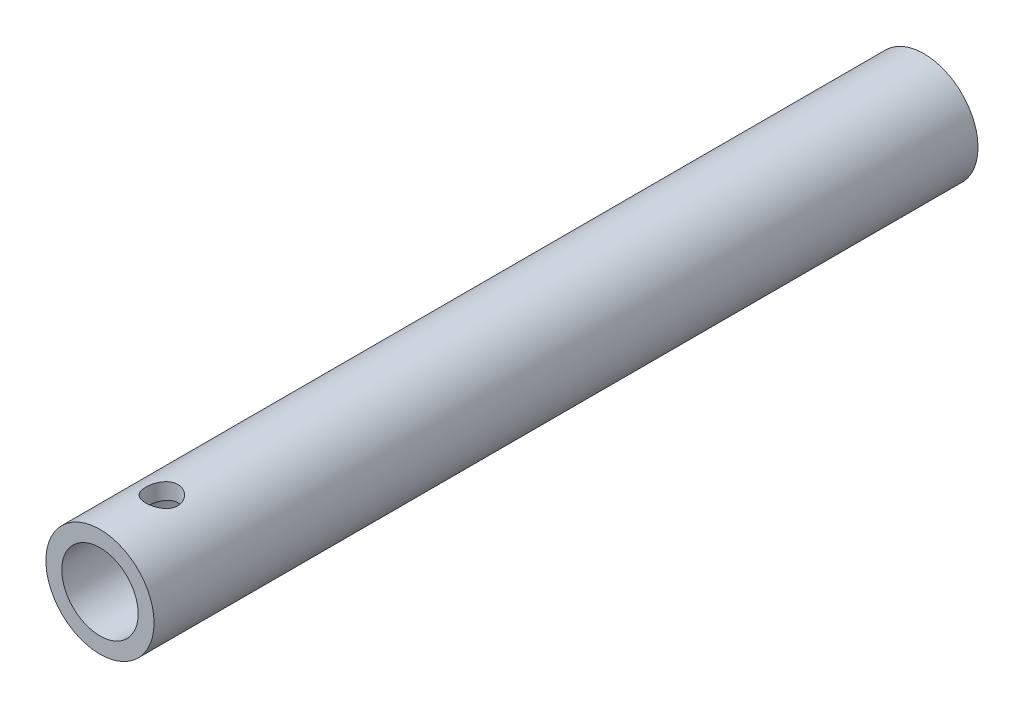
ISO-10303-21;
HEADER;
FILE_DESCRIPTION(('STEP AP214'),'2;1');
FILE_NAME('part.step','',(''),(''),'','','');
FILE_SCHEMA(('AUTOMOTIVE_DESIGN { 1 0 10303 214 1 1 1 1 }'));
ENDSEC;
DATA;
#1=APPLICATION_CONTEXT('core data for automotive mechanical design processes');
#2=APPLICATION_PROTOCOL_DEFINITION('international standard','automotive_design',2000,#1);
#3=PRODUCT_CONTEXT('',#1,'mechanical');
#4=PRODUCT('Part','Part','',(#3));
#5=PRODUCT_RELATED_PRODUCT_CATEGORY('part','',(#4));
#6=PRODUCT_DEFINITION_FORMATION('','',#4);
#7=PRODUCT_DEFINITION_CONTEXT('part definition',#1,'design');
#8=PRODUCT_DEFINITION('design','',#6,#7);
#9=PRODUCT_DEFINITION_SHAPE('','',#8);
#10=(LENGTH_UNIT() NAMED_UNIT(*) SI_UNIT(.MILLI.,.METRE.));
#11=(NAMED_UNIT(*) PLANE_ANGLE_UNIT() SI_UNIT($,.RADIAN.));
#12=(NAMED_UNIT(*) SI_UNIT($,.STERADIAN.) SOLID_ANGLE_UNIT());
#13=UNCERTAINTY_MEASURE_WITH_UNIT(LENGTH_MEASURE(1.E-05),#10,'distance_accuracy_value','');
#14=(GEOMETRIC_REPRESENTATION_CONTEXT(3) GLOBAL_UNCERTAINTY_ASSIGNED_CONTEXT((#13)) GLOBAL_UNIT_ASSIGNED_CONTEXT((#10,
#11,#12)) REPRESENTATION_CONTEXT('',''));
#15=CARTESIAN_POINT('',(0.,0.,0.));
#16=DIRECTION('',(0.,0.,1.));
#17=DIRECTION('',(1.,0.,0.));
#18=AXIS2_PLACEMENT_3D('',#15,#16,#17);
#19=CARTESIAN_POINT('',(0.,0.,101.6));
#20=DIRECTION('',(0.,0.,1.));
#21=DIRECTION('',(1.,0.,0.));
#22=AXIS2_PLACEMENT_3D('',#19,#20,#21);
#23=PLANE('',#22);
#24=CARTESIAN_POINT('',(0.,0.,101.6));
#25=DIRECTION('',(0.,0.,1.));
#26=DIRECTION('',(1.,0.,0.));
#27=AXIS2_PLACEMENT_3D('',#24,#25,#26);
#28=CIRCLE('',#27,13.335);
#29=CARTESIAN_POINT('',(13.335,0.,101.6));
#30=VERTEX_POINT('',#29);
#31=EDGE_CURVE('E11',#30,#30,#28,.T.);
#32=ORIENTED_EDGE('',*,*,#31,.T.);
#33=EDGE_LOOP('',(#32));
#34=FACE_BOUND('',#33,.T.);
#35=CARTESIAN_POINT('',(0.,0.,101.6));
#36=DIRECTION('',(0.,0.,1.));
#37=DIRECTION('',(1.,0.,0.));
#38=AXIS2_PLACEMENT_3D('',#35,#36,#37);
#39=CIRCLE('',#38,9.4234);
#40=CARTESIAN_POINT('',(9.4234,0.,101.6));
#41=VERTEX_POINT('',#40);
#42=EDGE_CURVE('E57',#41,#41,#39,.T.);
#43=ORIENTED_EDGE('',*,*,#42,.F.);
#44=EDGE_LOOP('',(#43));
#45=FACE_BOUND('',#44,.T.);
#46=ADVANCED_FACE('F38',(#34,#45),#23,.T.);
#47=CARTESIAN_POINT('',(0.,0.,-101.6));
#48=DIRECTION('',(0.,0.,1.));
#49=DIRECTION('',(1.,0.,0.));
#50=AXIS2_PLACEMENT_3D('',#47,#48,#49);
#51=PLANE('',#50);
#52=CARTESIAN_POINT('',(0.,0.,-101.6));
#53=DIRECTION('',(0.,0.,1.));
#54=DIRECTION('',(1.,0.,0.));
#55=AXIS2_PLACEMENT_3D('',#52,#53,#54);
#56=CIRCLE('',#55,13.335);
#57=CARTESIAN_POINT('',(13.335,0.,-101.6));
#58=VERTEX_POINT('',#57);
#59=EDGE_CURVE('E52',#58,#58,#56,.T.);
#60=ORIENTED_EDGE('',*,*,#59,.F.);
#61=EDGE_LOOP('',(#60));
#62=FACE_BOUND('',#61,.T.);
#63=CARTESIAN_POINT('',(0.,0.,-101.6));
#64=DIRECTION('',(0.,0.,1.));
#65=DIRECTION('',(1.,0.,0.));
#66=AXIS2_PLACEMENT_3D('',#63,#64,#65);
#67=CIRCLE('',#66,9.4234);
#68=CARTESIAN_POINT('',(9.4234,0.,-101.6));
#69=VERTEX_POINT('',#68);
#70=EDGE_CURVE('E60',#69,#69,#67,.T.);
#71=ORIENTED_EDGE('',*,*,#70,.T.);
#72=EDGE_LOOP('',(#71));
#73=FACE_BOUND('',#72,.T.);
#74=ADVANCED_FACE('F96',(#62,#73),#51,.F.);
#75=CARTESIAN_POINT('',(0.,0.,101.6));
#76=DIRECTION('',(0.,0.,-1.));
#77=DIRECTION('',(-1.,0.,0.));
#78=AXIS2_PLACEMENT_3D('',#75,#76,#77);
#79=CYLINDRICAL_SURFACE('',#78,13.335);
#80=CARTESIAN_POINT('',(0.,-13.335,90.32875));
#81=CARTESIAN_POINT('',(0.217801657248725,-13.3349979951073,90.3287471460463));
#82=CARTESIAN_POINT('',(0.435632212148242,-13.3296128171087,90.3107613449616));
#83=CARTESIAN_POINT('',(0.864954969055362,-13.3086561398753,90.2394608263766));
#84=CARTESIAN_POINT('',(1.07644517337238,-13.2930814647311,90.1861350938968));
#85=CARTESIAN_POINT('',(1.48683253161883,-13.2534532883283,90.046089192645));
#86=CARTESIAN_POINT('',(1.68574760015064,-13.2294121848068,89.9594178361606));
#87=CARTESIAN_POINT('',(2.06622161714672,-13.175353048173,89.7553397184868));
#88=CARTESIAN_POINT('',(2.24777833448264,-13.1453342482514,89.6379290134945));
#89=CARTESIAN_POINT('',(2.59352034348548,-13.0815746119971,89.3722032107425));
#90=CARTESIAN_POINT('',(2.75714495459207,-13.0477584121042,89.2231767229711));
#91=CARTESIAN_POINT('',(3.05748769493391,-12.9806673407283,88.8999661961774));
#92=CARTESIAN_POINT('',(3.19420138286407,-12.9473925594293,88.7257780127488));
#93=CARTESIAN_POINT('',(3.43977548025446,-12.8843565262752,88.3524647784297));
#94=CARTESIAN_POINT('',(3.54795450211116,-12.8546890366227,88.1528741773524));
#95=CARTESIAN_POINT('',(3.7289849170138,-12.803351666882,87.7373086178462));
#96=CARTESIAN_POINT('',(3.80184464206278,-12.7816799008502,87.5213375375726));
#97=CARTESIAN_POINT('',(3.90815202302676,-12.7495725580328,87.0854314738442));
#98=CARTESIAN_POINT('',(3.94263210089718,-12.7388433284211,86.8657704797935));
#99=CARTESIAN_POINT('',(3.97442493736721,-12.728961992042,86.4235397296291));
#100=CARTESIAN_POINT('',(3.97174654123139,-12.7298071300926,86.2009706783565));
#101=CARTESIAN_POINT('',(3.93011003079139,-12.7427185862238,85.7676113718458));
#102=CARTESIAN_POINT('',(3.89244194456287,-12.7543858824549,85.5566833213402));
#103=CARTESIAN_POINT('',(3.78397821425144,-12.7869820066187,85.1442872588875));
#104=CARTESIAN_POINT('',(3.71317934745467,-12.8079117355207,84.9428201693301));
#105=CARTESIAN_POINT('',(3.53950615657219,-12.8569953017419,84.5518941408584));
#106=CARTESIAN_POINT('',(3.43621094054166,-12.8852430214691,84.3626344785898));
#107=CARTESIAN_POINT('',(3.20076982630439,-12.9457342401759,84.0037012530624));
#108=CARTESIAN_POINT('',(3.0686170315323,-12.9779786935222,83.8340323865786));
#109=CARTESIAN_POINT('',(2.77279100544946,-13.0444517335439,83.5117760540147));
#110=CARTESIAN_POINT('',(2.60804623276305,-13.0787074234584,83.3601761667103));
#111=CARTESIAN_POINT('',(2.25504574973198,-13.1441687797354,83.0865278399612));
#112=CARTESIAN_POINT('',(2.0667886068938,-13.175374260057,82.9644812023837));
#113=CARTESIAN_POINT('',(1.67033245969353,-13.2314965713621,82.7528168715499));
#114=CARTESIAN_POINT('',(1.46201173561499,-13.2563711879933,82.6634152230033));
#115=CARTESIAN_POINT('',(1.03237981264901,-13.2967248811413,82.5212070776178));
#116=CARTESIAN_POINT('',(0.811072195687395,-13.3122065351056,82.4683905411884));
#117=CARTESIAN_POINT('',(0.370146644130141,-13.3316236021521,82.4024889935226));
#118=CARTESIAN_POINT('',(0.150745627597754,-13.3359479015249,82.3880652225286));
#119=CARTESIAN_POINT('',(-0.287354793134359,-13.3337022263028,82.3956104274115));
#120=CARTESIAN_POINT('',(-0.506054285599825,-13.3271336808076,82.4175746293255));
#121=CARTESIAN_POINT('',(-0.931511241185755,-13.3040947155063,82.4961884934866));
#122=CARTESIAN_POINT('',(-1.13842595605437,-13.2878470020258,82.5520585469437));
#123=CARTESIAN_POINT('',(-1.53990168676338,-13.2473270326897,82.6959626460989));
#124=CARTESIAN_POINT('',(-1.73446122307418,-13.2230538179341,82.7840005353941));
#125=CARTESIAN_POINT('',(-2.11065046323329,-13.1683090897719,82.9920059255623));
#126=CARTESIAN_POINT('',(-2.29188223645015,-13.1377084090472,83.1126582019608));
#127=CARTESIAN_POINT('',(-2.63198414682391,-13.0738241647799,83.3816333162117));
#128=CARTESIAN_POINT('',(-2.79084874879897,-13.0405399403371,83.529962982317));
#129=CARTESIAN_POINT('',(-3.08758319231091,-12.9735517984532,83.856370071153));
#130=CARTESIAN_POINT('',(-3.22450099754792,-12.9398753215303,84.0353204749268));
#131=CARTESIAN_POINT('',(-3.46642713094544,-12.8771806839132,84.4143883137041));
#132=CARTESIAN_POINT('',(-3.57143634867674,-12.8481623933653,84.6145051584045));
#133=CARTESIAN_POINT('',(-3.7458366063829,-12.7984049437592,85.02955204113));
#134=CARTESIAN_POINT('',(-3.81539800748344,-12.7776262943009,85.2444054877054));
#135=CARTESIAN_POINT('',(-3.91715220159697,-12.7468044971304,85.6835081475452));
#136=CARTESIAN_POINT('',(-3.94935754387455,-12.7367577442721,85.9077541792525));
#137=CARTESIAN_POINT('',(-3.97464157655354,-12.7288885166679,86.3493975177951));
#138=CARTESIAN_POINT('',(-3.96927047217433,-12.730581688344,86.5666986174296));
#139=CARTESIAN_POINT('',(-3.92324660774102,-12.7448392923629,86.9971499433326));
#140=CARTESIAN_POINT('',(-3.88259521909483,-12.7574033021368,87.2103003306175));
#141=CARTESIAN_POINT('',(-3.76815828761905,-12.7916646354377,87.623909512707));
#142=CARTESIAN_POINT('',(-3.69477705406194,-12.8132503160803,87.8244901006468));
#143=CARTESIAN_POINT('',(-3.51727776262069,-12.8631038904964,88.2106526683932));
#144=CARTESIAN_POINT('',(-3.41315389413686,-12.8913730472979,88.3962318043535));
#145=CARTESIAN_POINT('',(-3.17274468751317,-12.952675705475,88.7543329383036));
#146=CARTESIAN_POINT('',(-3.03543853155,-12.9858438594328,88.9261465631119));
#147=CARTESIAN_POINT('',(-2.73440751688654,-13.0525465777174,89.2447967345968));
#148=CARTESIAN_POINT('',(-2.57067584115867,-13.0860812345046,89.3916268161024));
#149=CARTESIAN_POINT('',(-2.21579772156596,-13.1508887501183,89.6603251588312));
#150=CARTESIAN_POINT('',(-2.02400088147307,-13.1820694313294,89.7813589305416));
#151=CARTESIAN_POINT('',(-1.62185218604414,-13.2375569009697,89.9892908059882));
#152=CARTESIAN_POINT('',(-1.41150932111639,-13.2618669962229,90.0762053392305));
#153=CARTESIAN_POINT('',(-1.00243842570967,-13.2986739065946,90.2053683318417));
#154=CARTESIAN_POINT('',(-0.80502476195778,-13.3121846548019,90.2515124869288));
#155=CARTESIAN_POINT('',(-0.405081843520071,-13.3303479202372,90.3132021833498));
#156=CARTESIAN_POINT('',(-0.202553418287168,-13.3350018645306,90.3287526541491));
#157=CARTESIAN_POINT('',(0.,-13.335,90.32875));
#158=B_SPLINE_CURVE_WITH_KNOTS('',3,(#80,#81,#82,#83,#84,#85,#86,#87,#88,#89,#90,#91,#92,#93,
#94,#95,#96,#97,#98,#99,#100,#101,#102,#103,#104,#105,#106,#107,#108,#109,#110,#111,#112,#113,
#114,#115,#116,#117,#118,#119,#120,#121,#122,#123,#124,#125,#126,#127,#128,#129,#130,#131,#132,
#133,#134,#135,#136,#137,#138,#139,#140,#141,#142,#143,#144,#145,#146,#147,#148,#149,#150,#151,
#152,#153,#154,#155,#156,#157),.UNSPECIFIED.,.T.,.F.,(4,2,2,2,2,2,2,2,2,2,2,2,2,2,2,2,2,2,2,2,2,
2,2,2,2,2,2,2,2,2,2,2,2,2,2,2,2,2,4),(0.,0.652661039190063,1.3055255997492,1.95743809226534,
2.60943426499523,3.27804781815071,3.94677162510964,4.63025563809132,5.31357833513247,
5.97803842037036,6.64234033914577,7.28308280722761,7.92388761489102,8.57335978163196,
9.2229873335138,9.89929210579712,10.5756381021346,11.2563823377828,11.9369396912955,
12.5934345955664,13.2498433770336,13.8917025848707,14.5336385108098,15.1902691405347,
15.847061981451,16.5273033830373,17.207525818619,17.8844475427663,18.5611417982617,
19.2100888133233,19.8590106037806,20.5001292456825,21.1413691417051,21.805640381558,
22.4700832590852,23.1535387688474,23.8366647680073,24.4437309955573,25.0506994003929),.UNSPECIFIED.);
#159=CARTESIAN_POINT('',(0.,-13.335,90.32875));
#160=VERTEX_POINT('',#159);
#161=EDGE_CURVE('E85',#160,#160,#158,.T.);
#162=ORIENTED_EDGE('',*,*,#161,.T.);
#163=EDGE_LOOP('',(#162));
#164=FACE_BOUND('',#163,.T.);
#165=CARTESIAN_POINT('',(0.,13.335,90.32875));
#166=CARTESIAN_POINT('',(-0.217801657248725,13.3349979951073,90.3287471460463));
#167=CARTESIAN_POINT('',(-0.435632212148242,13.3296128171087,90.3107613449616));
#168=CARTESIAN_POINT('',(-0.864954969055362,13.3086561398753,90.2394608263766));
#169=CARTESIAN_POINT('',(-1.07644517337238,13.2930814647311,90.1861350938968));
#170=CARTESIAN_POINT('',(-1.48683253161883,13.2534532883283,90.046089192645));
#171=CARTESIAN_POINT('',(-1.68574760015064,13.2294121848068,89.9594178361606));
#172=CARTESIAN_POINT('',(-2.06622161714672,13.175353048173,89.7553397184868));
#173=CARTESIAN_POINT('',(-2.24777833448264,13.1453342482514,89.6379290134945));
#174=CARTESIAN_POINT('',(-2.59352034348548,13.0815746119971,89.3722032107425));
#175=CARTESIAN_POINT('',(-2.75714495459207,13.0477584121042,89.2231767229711));
#176=CARTESIAN_POINT('',(-3.05748769493391,12.9806673407283,88.8999661961774));
#177=CARTESIAN_POINT('',(-3.19420138286407,12.9473925594293,88.7257780127488));
#178=CARTESIAN_POINT('',(-3.43977548025446,12.8843565262752,88.3524647784297));
#179=CARTESIAN_POINT('',(-3.54795450211116,12.8546890366227,88.1528741773524));
#180=CARTESIAN_POINT('',(-3.7289849170138,12.803351666882,87.7373086178462));
#181=CARTESIAN_POINT('',(-3.80184464206278,12.7816799008502,87.5213375375726));
#182=CARTESIAN_POINT('',(-3.90815202302676,12.7495725580328,87.0854314738442));
#183=CARTESIAN_POINT('',(-3.94263210089718,12.7388433284211,86.8657704797935));
#184=CARTESIAN_POINT('',(-3.97442493736721,12.728961992042,86.4235397296291));
#185=CARTESIAN_POINT('',(-3.97174654123139,12.7298071300926,86.2009706783565));
#186=CARTESIAN_POINT('',(-3.93011003079139,12.7427185862238,85.7676113718458));
#187=CARTESIAN_POINT('',(-3.89244194456287,12.7543858824549,85.5566833213402));
#188=CARTESIAN_POINT('',(-3.78397821425144,12.7869820066187,85.1442872588875));
#189=CARTESIAN_POINT('',(-3.71317934745467,12.8079117355207,84.9428201693301));
#190=CARTESIAN_POINT('',(-3.53950615657219,12.8569953017419,84.5518941408584));
#191=CARTESIAN_POINT('',(-3.43621094054166,12.8852430214691,84.3626344785898));
#192=CARTESIAN_POINT('',(-3.20076982630439,12.9457342401759,84.0037012530624));
#193=CARTESIAN_POINT('',(-3.0686170315323,12.9779786935222,83.8340323865786));
#194=CARTESIAN_POINT('',(-2.77279100544946,13.0444517335439,83.5117760540147));
#195=CARTESIAN_POINT('',(-2.60804623276305,13.0787074234584,83.3601761667103));
#196=CARTESIAN_POINT('',(-2.25504574973198,13.1441687797354,83.0865278399612));
#197=CARTESIAN_POINT('',(-2.0667886068938,13.175374260057,82.9644812023837));
#198=CARTESIAN_POINT('',(-1.67033245969353,13.2314965713621,82.7528168715499));
#199=CARTESIAN_POINT('',(-1.46201173561499,13.2563711879933,82.6634152230033));
#200=CARTESIAN_POINT('',(-1.03237981264901,13.2967248811413,82.5212070776178));
#201=CARTESIAN_POINT('',(-0.811072195687395,13.3122065351056,82.4683905411884));
#202=CARTESIAN_POINT('',(-0.370146644130141,13.3316236021521,82.4024889935226));
#203=CARTESIAN_POINT('',(-0.150745627597754,13.3359479015249,82.3880652225286));
#204=CARTESIAN_POINT('',(0.287354793134359,13.3337022263028,82.3956104274115));
#205=CARTESIAN_POINT('',(0.506054285599825,13.3271336808076,82.4175746293255));
#206=CARTESIAN_POINT('',(0.931511241185755,13.3040947155063,82.4961884934866));
#207=CARTESIAN_POINT('',(1.13842595605437,13.2878470020258,82.5520585469437));
#208=CARTESIAN_POINT('',(1.53990168676338,13.2473270326897,82.6959626460989));
#209=CARTESIAN_POINT('',(1.73446122307418,13.2230538179341,82.7840005353941));
#210=CARTESIAN_POINT('',(2.11065046323329,13.1683090897719,82.9920059255623));
#211=CARTESIAN_POINT('',(2.29188223645015,13.1377084090472,83.1126582019608));
#212=CARTESIAN_POINT('',(2.63198414682391,13.0738241647799,83.3816333162117));
#213=CARTESIAN_POINT('',(2.79084874879897,13.0405399403371,83.529962982317));
#214=CARTESIAN_POINT('',(3.08758319231091,12.9735517984532,83.856370071153));
#215=CARTESIAN_POINT('',(3.22450099754792,12.9398753215303,84.0353204749268));
#216=CARTESIAN_POINT('',(3.46642713094544,12.8771806839132,84.4143883137041));
#217=CARTESIAN_POINT('',(3.57143634867674,12.8481623933653,84.6145051584045));
#218=CARTESIAN_POINT('',(3.7458366063829,12.7984049437592,85.02955204113));
#219=CARTESIAN_POINT('',(3.81539800748344,12.7776262943009,85.2444054877054));
#220=CARTESIAN_POINT('',(3.91715220159697,12.7468044971304,85.6835081475452));
#221=CARTESIAN_POINT('',(3.94935754387455,12.7367577442721,85.9077541792525));
#222=CARTESIAN_POINT('',(3.97464157655354,12.7288885166679,86.3493975177951));
#223=CARTESIAN_POINT('',(3.96927047217433,12.730581688344,86.5666986174296));
#224=CARTESIAN_POINT('',(3.92324660774102,12.7448392923629,86.9971499433326));
#225=CARTESIAN_POINT('',(3.88259521909483,12.7574033021368,87.2103003306175));
#226=CARTESIAN_POINT('',(3.76815828761905,12.7916646354377,87.623909512707));
#227=CARTESIAN_POINT('',(3.69477705406194,12.8132503160803,87.8244901006468));
#228=CARTESIAN_POINT('',(3.51727776262069,12.8631038904964,88.2106526683932));
#229=CARTESIAN_POINT('',(3.41315389413686,12.8913730472979,88.3962318043535));
#230=CARTESIAN_POINT('',(3.17274468751317,12.952675705475,88.7543329383036));
#231=CARTESIAN_POINT('',(3.03543853155,12.9858438594328,88.9261465631119));
#232=CARTESIAN_POINT('',(2.73440751688654,13.0525465777174,89.2447967345968));
#233=CARTESIAN_POINT('',(2.57067584115867,13.0860812345046,89.3916268161024));
#234=CARTESIAN_POINT('',(2.21579772156596,13.1508887501183,89.6603251588312));
#235=CARTESIAN_POINT('',(2.02400088147307,13.1820694313294,89.7813589305416));
#236=CARTESIAN_POINT('',(1.62185218604414,13.2375569009697,89.9892908059882));
#237=CARTESIAN_POINT('',(1.41150932111639,13.2618669962229,90.0762053392305));
#238=CARTESIAN_POINT('',(1.00243842570967,13.2986739065946,90.2053683318417));
#239=CARTESIAN_POINT('',(0.80502476195778,13.3121846548019,90.2515124869288));
#240=CARTESIAN_POINT('',(0.405081843520071,13.3303479202372,90.3132021833498));
#241=CARTESIAN_POINT('',(0.202553418287168,13.3350018645306,90.3287526541491));
#242=CARTESIAN_POINT('',(0.,13.335,90.32875));
#243=B_SPLINE_CURVE_WITH_KNOTS('',3,(#165,#166,#167,#168,#169,#170,#171,#172,#173,#174,#175,
#176,#177,#178,#179,#180,#181,#182,#183,#184,#185,#186,#187,#188,#189,#190,#191,#192,#193,#194,
#195,#196,#197,#198,#199,#200,#201,#202,#203,#204,#205,#206,#207,#208,#209,#210,#211,#212,#213,
#214,#215,#216,#217,#218,#219,#220,#221,#222,#223,#224,#225,#226,#227,#228,#229,#230,#231,#232,
#233,#234,#235,#236,#237,#238,#239,#240,#241,#242),.UNSPECIFIED.,.T.,.F.,(4,2,2,2,2,2,2,2,2,2,2,
2,2,2,2,2,2,2,2,2,2,2,2,2,2,2,2,2,2,2,2,2,2,2,2,2,2,2,4),(0.,0.652661039190063,1.3055255997492,
1.95743809226534,2.60943426499523,3.27804781815071,3.94677162510964,4.63025563809132,
5.31357833513247,5.97803842037036,6.64234033914577,7.28308280722761,7.92388761489102,
8.57335978163196,9.2229873335138,9.89929210579712,10.5756381021346,11.2563823377828,
11.9369396912955,12.5934345955664,13.2498433770336,13.8917025848707,14.5336385108098,
15.1902691405347,15.847061981451,16.5273033830373,17.207525818619,17.8844475427663,
18.5611417982617,19.2100888133233,19.8590106037806,20.5001292456825,21.1413691417051,
21.805640381558,22.4700832590852,23.1535387688474,23.8366647680073,24.4437309955573,
25.0506994003929),.UNSPECIFIED.);
#244=CARTESIAN_POINT('',(0.,13.335,90.32875));
#245=VERTEX_POINT('',#244);
#246=EDGE_CURVE('E80',#245,#245,#243,.T.);
#247=ORIENTED_EDGE('',*,*,#246,.T.);
#248=EDGE_LOOP('',(#247));
#249=FACE_BOUND('',#248,.T.);
#250=ORIENTED_EDGE('',*,*,#31,.F.);
#251=EDGE_LOOP('',(#250));
#252=FACE_BOUND('',#251,.T.);
#253=ORIENTED_EDGE('',*,*,#59,.T.);
#254=EDGE_LOOP('',(#253));
#255=FACE_BOUND('',#254,.T.);
#256=ADVANCED_FACE('F40',(#164,#249,#252,#255),#79,.T.);
#257=CARTESIAN_POINT('',(0.,0.,101.6));
#258=DIRECTION('',(0.,0.,-1.));
#259=DIRECTION('',(-1.,0.,0.));
#260=AXIS2_PLACEMENT_3D('',#257,#258,#259);
#261=CYLINDRICAL_SURFACE('',#260,9.4234);
#262=CARTESIAN_POINT('',(0.,-9.4234,90.32875));
#263=CARTESIAN_POINT('',(0.106240075960907,-9.42339938198094,90.3287492212765));
#264=CARTESIAN_POINT('',(0.212514989804776,-9.42159834051511,90.3244780605921));
#265=CARTESIAN_POINT('',(0.424305195727541,-9.4144397330074,90.3074348758865));
#266=CARTESIAN_POINT('',(0.529819973047572,-9.40907995088941,90.2946575549508));
#267=CARTESIAN_POINT('',(0.739484237648256,-9.39492858692938,90.2606964950692));
#268=CARTESIAN_POINT('',(0.843630520462743,-9.38613006421148,90.2394957525455));
#269=CARTESIAN_POINT('',(1.04960430544375,-9.36533740258717,90.188913172825));
#270=CARTESIAN_POINT('',(1.1514308414313,-9.35334195764688,90.1595279918302));
#271=CARTESIAN_POINT('',(1.45160177699669,-9.31309865203195,90.059740204543));
#272=CARTESIAN_POINT('',(1.64559507341417,-9.28052503160554,89.977547695962));
#273=CARTESIAN_POINT('',(2.0167473153744,-9.20701451245516,89.7845510267082));
#274=CARTESIAN_POINT('',(2.19391113701978,-9.16608004706252,89.673755188247));
#275=CARTESIAN_POINT('',(2.53584511187359,-9.07758567602218,89.4206783037325));
#276=CARTESIAN_POINT('',(2.69965095758305,-9.02980571838877,89.277169154212));
#277=CARTESIAN_POINT('',(3.00168473282224,-8.93395339956159,88.9653916360547));
#278=CARTESIAN_POINT('',(3.13989892338434,-8.88588089553376,88.7971100547663));
#279=CARTESIAN_POINT('',(3.39380239668949,-8.79214688794031,88.4300799551102));
#280=CARTESIAN_POINT('',(3.50800087189974,-8.74672989991497,88.2302217142684));
#281=CARTESIAN_POINT('',(3.65249441902187,-8.68691320141893,87.9167781275267));
#282=CARTESIAN_POINT('',(3.69620328933599,-8.66835352926533,87.8099769349783));
#283=CARTESIAN_POINT('',(3.77428256414871,-8.63464364903745,87.5925120936843));
#284=CARTESIAN_POINT('',(3.80865780404848,-8.6194916762642,87.4818504785401));
#285=CARTESIAN_POINT('',(3.86624601500758,-8.59380911150725,87.2629429742409));
#286=CARTESIAN_POINT('',(3.88991913572042,-8.58309016922248,87.1548398426074));
#287=CARTESIAN_POINT('',(3.92817603009865,-8.56564909119619,86.9367629549724));
#288=CARTESIAN_POINT('',(3.94276403148628,-8.55892509648964,86.8267900935543));
#289=CARTESIAN_POINT('',(3.96267930500476,-8.5497228890482,86.6058612267286));
#290=CARTESIAN_POINT('',(3.96800909134502,-8.54724352362217,86.4949054964634));
#291=CARTESIAN_POINT('',(3.96934676477657,-8.54662240123676,86.2729302986888));
#292=CARTESIAN_POINT('',(3.96535515871798,-8.54848040843303,86.1619108349732));
#293=CARTESIAN_POINT('',(3.94878307339214,-8.55614724000891,85.9494847421181));
#294=CARTESIAN_POINT('',(3.93690549984708,-8.56163259656421,85.8480111187919));
#295=CARTESIAN_POINT('',(3.9054220874374,-8.57603843102491,85.646507639324));
#296=CARTESIAN_POINT('',(3.88581372583557,-8.58496003023481,85.5464782655314));
#297=CARTESIAN_POINT('',(3.81566347518012,-8.6164890889798,85.2496216401734));
#298=CARTESIAN_POINT('',(3.75378245243777,-8.6438678227288,85.0558513432841));
#299=CARTESIAN_POINT('',(3.60037980127225,-8.70888895517429,84.6774738741344));
#300=CARTESIAN_POINT('',(3.50824966639939,-8.74673931226452,84.4931531742862));
#301=CARTESIAN_POINT('',(3.29737767785282,-8.82839387865769,84.1418324183798));
#302=CARTESIAN_POINT('',(3.17862520340016,-8.87220046139911,83.974839314036));
#303=CARTESIAN_POINT('',(2.9058264908342,-8.9654410210124,83.6477431893804));
#304=CARTESIAN_POINT('',(2.74961555419121,-9.01503395282689,83.48948643089));
#305=CARTESIAN_POINT('',(2.41238971318981,-9.11106799581317,83.2007865544241));
#306=CARTESIAN_POINT('',(2.23136876376763,-9.15750833470612,83.0703502348756));
#307=CARTESIAN_POINT('',(1.84394962217772,-9.2434065785985,82.838209870343));
#308=CARTESIAN_POINT('',(1.63704588010765,-9.28266973345041,82.7372721346553));
#309=CARTESIAN_POINT('',(1.20711814978088,-9.34828841036972,82.5722867648405));
#310=CARTESIAN_POINT('',(0.984103349335443,-9.37465122358845,82.5082182889431));
#311=CARTESIAN_POINT('',(0.543694112617849,-9.41012765549325,82.4226892292396));
#312=CARTESIAN_POINT('',(0.326861042870788,-9.42024182325027,82.3987528003164));
#313=CARTESIAN_POINT('',(-0.107942483555394,-9.42528668974206,82.386766691496));
#314=CARTESIAN_POINT('',(-0.325912585683475,-9.42022186854318,82.3987064227818));
#315=CARTESIAN_POINT('',(-0.745105292090159,-9.39612483840259,82.4563749594942));
#316=CARTESIAN_POINT('',(-0.946615396501195,-9.37781729830928,82.5003515008167));
#317=CARTESIAN_POINT('',(-1.33916878026954,-9.3298565535632,82.6183922246131));
#318=CARTESIAN_POINT('',(-1.53021074102916,-9.30020192333669,82.6924601876475));
#319=CARTESIAN_POINT('',(-1.90312555311569,-9.23123373880139,82.8709938968204));
#320=CARTESIAN_POINT('',(-2.08452755033586,-9.19164813397146,82.9763344977064));
#321=CARTESIAN_POINT('',(-2.42773446221661,-9.10702290553189,83.2134742491304));
#322=CARTESIAN_POINT('',(-2.58953107410455,-9.06198098723893,83.3452845470831));
#323=CARTESIAN_POINT('',(-2.90132880846329,-8.9672303373,83.6428224640166));
#324=CARTESIAN_POINT('',(-3.04960871592284,-8.91742084520366,83.8103227721653));
#325=CARTESIAN_POINT('',(-3.31649821784703,-8.82164769864855,84.1687291452444));
#326=CARTESIAN_POINT('',(-3.43510052260264,-8.77568499091689,84.3596409436132));
#327=CARTESIAN_POINT('',(-3.58878671015347,-8.71344906906987,84.6615706870484));
#328=CARTESIAN_POINT('',(-3.63626626504746,-8.69368800470774,84.7657289739814));
#329=CARTESIAN_POINT('',(-3.72219606990599,-8.65724575419005,84.9782101508412));
#330=CARTESIAN_POINT('',(-3.76065030775624,-8.64056320847331,85.086531176724));
#331=CARTESIAN_POINT('',(-3.82810308123366,-8.61089157768957,85.3065119586902));
#332=CARTESIAN_POINT('',(-3.85710614462237,-8.59790072443114,85.4181700879994));
#333=CARTESIAN_POINT('',(-3.90533164777404,-8.57610375214736,85.6439801690483));
#334=CARTESIAN_POINT('',(-3.92455503597215,-8.56729722733034,85.7581318778399));
#335=CARTESIAN_POINT('',(-3.95185111909967,-8.5547382279125,85.9789059740386));
#336=CARTESIAN_POINT('',(-3.9606807743336,-8.5506432376539,86.0854158665165));
#337=CARTESIAN_POINT('',(-3.96971858416966,-8.54645114295224,86.2989172359737));
#338=CARTESIAN_POINT('',(-3.96992385544269,-8.54635537554105,86.4059088620519));
#339=CARTESIAN_POINT('',(-3.96170088385316,-8.55017056490491,86.6194356215004));
#340=CARTESIAN_POINT('',(-3.95327724070706,-8.5540793869995,86.7259709677114));
#341=CARTESIAN_POINT('',(-3.92791315068795,-8.56575438119719,86.9378215303876));
#342=CARTESIAN_POINT('',(-3.91096949389187,-8.57352200709489,87.0431362716786));
#343=CARTESIAN_POINT('',(-3.84967749382727,-8.60130678725191,87.345808124327));
#344=CARTESIAN_POINT('',(-3.79439121636078,-8.62605566484768,87.5406380202131));
#345=CARTESIAN_POINT('',(-3.65563004504921,-8.68576265144539,87.9181736774583));
#346=CARTESIAN_POINT('',(-3.57214719515509,-8.72072364155796,88.1008759994273));
#347=CARTESIAN_POINT('',(-3.37349877939562,-8.79954769896629,88.461265526725));
#348=CARTESIAN_POINT('',(-3.25671454583701,-8.84382298268451,88.6379712076821));
#349=CARTESIAN_POINT('',(-2.99705889746564,-8.93515865204285,88.9702006411966));
#350=CARTESIAN_POINT('',(-2.85417812523152,-8.98222003258798,89.1257167607884));
#351=CARTESIAN_POINT('',(-2.5335044776127,-9.07809209443194,89.4232640621497));
#352=CARTESIAN_POINT('',(-2.35389568720322,-9.12676877491072,89.5634057821588));
#353=CARTESIAN_POINT('',(-2.06768826656311,-9.19428215577219,89.749492748845));
#354=CARTESIAN_POINT('',(-1.96939912266746,-9.21588514962744,89.8075385297314));
#355=CARTESIAN_POINT('',(-1.76780549145224,-9.25666670269652,89.915118676107));
#356=CARTESIAN_POINT('',(-1.66450334789133,-9.27584638006779,89.9646569709065));
#357=CARTESIAN_POINT('',(-1.45518863453798,-9.31096062580718,90.0540710751922));
#358=CARTESIAN_POINT('',(-1.34924187164573,-9.32694042487195,90.0940833397378));
#359=CARTESIAN_POINT('',(-1.13394841798059,-9.35555502498232,90.1649930123567));
#360=CARTESIAN_POINT('',(-1.02460337134648,-9.36819141630805,90.1958947546202));
#361=CARTESIAN_POINT('',(-0.803595042734439,-9.38972853586481,90.2481972230795));
#362=CARTESIAN_POINT('',(-0.691938175453157,-9.39863844177763,90.2696212987206));
#363=CARTESIAN_POINT('',(-0.467011597053415,-9.41249405168224,90.3028141001184));
#364=CARTESIAN_POINT('',(-0.35374312093834,-9.41744264062227,90.3145898527038));
#365=CARTESIAN_POINT('',(-0.200195638819718,-9.42135836464217,90.3239002028369));
#366=CARTESIAN_POINT('',(-0.160183661639881,-9.42212353595654,90.3257183511663));
#367=CARTESIAN_POINT('',(-0.0801161075758915,-9.42314447118303,90.3281433990102));
#368=CARTESIAN_POINT('',(-0.0400605305164801,-9.42340023303985,90.3287502936376));
#369=CARTESIAN_POINT('',(0.,-9.4234,90.32875));
#370=B_SPLINE_CURVE_WITH_KNOTS('',3,(#262,#263,#264,#265,#266,#267,#268,#269,#270,#271,#272,
#273,#274,#275,#276,#277,#278,#279,#280,#281,#282,#283,#284,#285,#286,#287,#288,#289,#290,#291,
#292,#293,#294,#295,#296,#297,#298,#299,#300,#301,#302,#303,#304,#305,#306,#307,#308,#309,#310,
#311,#312,#313,#314,#315,#316,#317,#318,#319,#320,#321,#322,#323,#324,#325,#326,#327,#328,#329,
#330,#331,#332,#333,#334,#335,#336,#337,#338,#339,#340,#341,#342,#343,#344,#345,#346,#347,#348,
#349,#350,#351,#352,#353,#354,#355,#356,#357,#358,#359,#360,#361,#362,#363,#364,#365,#366,#367,
#368,#369),.UNSPECIFIED.,.T.,.F.,(4,2,2,2,2,2,2,2,2,2,2,2,2,2,2,2,2,2,2,2,2,2,2,2,2,2,2,2,2,2,2,
2,2,2,2,2,2,2,2,2,2,2,2,2,2,2,2,2,2,2,2,2,2,4),(0.,0.318679349332687,0.63755733097071,
0.957082299162939,1.27673800304221,1.91316765149165,2.54941233739754,3.21535092434049,
3.88164599263545,4.5816039165673,4.93185395843073,5.28192220126773,5.6150282854057,
5.9479792439701,6.28083977048297,6.61368219814745,6.92024909563334,7.22691611598988,
7.83973094738792,8.46571761647603,9.09195446398041,9.77237454379434,10.4529607065297,
11.1499121162542,11.8464691593374,12.4982163407125,13.1497711783789,13.7681345757024,
14.3865756856554,15.0242772453335,15.6622479311821,16.3467531833204,17.0314264057902,
17.3795287827586,17.7274770579951,18.0752583962159,18.4230060000896,18.7434515597495,
19.0640042508473,19.3843861574715,19.7048888588146,20.3140423834424,20.9233679328708,
21.56976777842,22.2163998598616,22.9115875246312,23.2597536413804,23.6077585173642,
23.95042971358,24.292937625238,24.6345969606094,24.9760072453378,25.0961729377569,
25.2163391150063),.UNSPECIFIED.);
#371=CARTESIAN_POINT('',(0.,-9.4234,90.32875));
#372=VERTEX_POINT('',#371);
#373=EDGE_CURVE('E43',#372,#372,#370,.T.);
#374=ORIENTED_EDGE('',*,*,#373,.F.);
#375=EDGE_LOOP('',(#374));
#376=FACE_BOUND('',#375,.T.);
#377=CARTESIAN_POINT('',(0.,9.4234,90.32875));
#378=CARTESIAN_POINT('',(-0.106240075960907,9.42339938198094,90.3287492212765));
#379=CARTESIAN_POINT('',(-0.212514989804776,9.42159834051511,90.3244780605921));
#380=CARTESIAN_POINT('',(-0.424305195727541,9.4144397330074,90.3074348758865));
#381=CARTESIAN_POINT('',(-0.529819973047572,9.40907995088941,90.2946575549508));
#382=CARTESIAN_POINT('',(-0.739484237648256,9.39492858692938,90.2606964950692));
#383=CARTESIAN_POINT('',(-0.843630520462743,9.38613006421148,90.2394957525455));
#384=CARTESIAN_POINT('',(-1.04960430544375,9.36533740258717,90.188913172825));
#385=CARTESIAN_POINT('',(-1.1514308414313,9.35334195764688,90.1595279918302));
#386=CARTESIAN_POINT('',(-1.45160177699669,9.31309865203195,90.059740204543));
#387=CARTESIAN_POINT('',(-1.64559507341417,9.28052503160554,89.977547695962));
#388=CARTESIAN_POINT('',(-2.0167473153744,9.20701451245516,89.7845510267082));
#389=CARTESIAN_POINT('',(-2.19391113701978,9.16608004706252,89.673755188247));
#390=CARTESIAN_POINT('',(-2.53584511187359,9.07758567602218,89.4206783037325));
#391=CARTESIAN_POINT('',(-2.69965095758305,9.02980571838877,89.277169154212));
#392=CARTESIAN_POINT('',(-3.00168473282224,8.93395339956159,88.9653916360547));
#393=CARTESIAN_POINT('',(-3.13989892338434,8.88588089553376,88.7971100547663));
#394=CARTESIAN_POINT('',(-3.39380239668949,8.79214688794031,88.4300799551102));
#395=CARTESIAN_POINT('',(-3.50800087189974,8.74672989991497,88.2302217142684));
#396=CARTESIAN_POINT('',(-3.65249441902187,8.68691320141893,87.9167781275267));
#397=CARTESIAN_POINT('',(-3.69620328933599,8.66835352926533,87.8099769349783));
#398=CARTESIAN_POINT('',(-3.77428256414871,8.63464364903745,87.5925120936843));
#399=CARTESIAN_POINT('',(-3.80865780404848,8.6194916762642,87.4818504785401));
#400=CARTESIAN_POINT('',(-3.86624601500758,8.59380911150725,87.2629429742409));
#401=CARTESIAN_POINT('',(-3.88991913572042,8.58309016922248,87.1548398426074));
#402=CARTESIAN_POINT('',(-3.92817603009865,8.56564909119619,86.9367629549724));
#403=CARTESIAN_POINT('',(-3.94276403148628,8.55892509648964,86.8267900935543));
#404=CARTESIAN_POINT('',(-3.96267930500476,8.5497228890482,86.6058612267286));
#405=CARTESIAN_POINT('',(-3.96800909134502,8.54724352362217,86.4949054964634));
#406=CARTESIAN_POINT('',(-3.96934676477657,8.54662240123676,86.2729302986888));
#407=CARTESIAN_POINT('',(-3.96535515871798,8.54848040843303,86.1619108349732));
#408=CARTESIAN_POINT('',(-3.94878307339214,8.55614724000891,85.9494847421181));
#409=CARTESIAN_POINT('',(-3.93690549984708,8.56163259656421,85.8480111187919));
#410=CARTESIAN_POINT('',(-3.9054220874374,8.57603843102491,85.646507639324));
#411=CARTESIAN_POINT('',(-3.88581372583557,8.58496003023481,85.5464782655314));
#412=CARTESIAN_POINT('',(-3.81566347518012,8.6164890889798,85.2496216401734));
#413=CARTESIAN_POINT('',(-3.75378245243777,8.6438678227288,85.0558513432841));
#414=CARTESIAN_POINT('',(-3.60037980127225,8.70888895517429,84.6774738741344));
#415=CARTESIAN_POINT('',(-3.50824966639939,8.74673931226452,84.4931531742862));
#416=CARTESIAN_POINT('',(-3.29737767785282,8.82839387865769,84.1418324183798));
#417=CARTESIAN_POINT('',(-3.17862520340016,8.87220046139911,83.974839314036));
#418=CARTESIAN_POINT('',(-2.9058264908342,8.9654410210124,83.6477431893804));
#419=CARTESIAN_POINT('',(-2.74961555419121,9.01503395282689,83.48948643089));
#420=CARTESIAN_POINT('',(-2.41238971318981,9.11106799581317,83.2007865544241));
#421=CARTESIAN_POINT('',(-2.23136876376763,9.15750833470612,83.0703502348756));
#422=CARTESIAN_POINT('',(-1.84394962217772,9.2434065785985,82.838209870343));
#423=CARTESIAN_POINT('',(-1.63704588010765,9.28266973345041,82.7372721346553));
#424=CARTESIAN_POINT('',(-1.20711814978088,9.34828841036972,82.5722867648405));
#425=CARTESIAN_POINT('',(-0.984103349335443,9.37465122358845,82.5082182889431));
#426=CARTESIAN_POINT('',(-0.543694112617849,9.41012765549325,82.4226892292396));
#427=CARTESIAN_POINT('',(-0.326861042870788,9.42024182325027,82.3987528003164));
#428=CARTESIAN_POINT('',(0.107942483555394,9.42528668974206,82.386766691496));
#429=CARTESIAN_POINT('',(0.325912585683475,9.42022186854318,82.3987064227818));
#430=CARTESIAN_POINT('',(0.745105292090159,9.39612483840259,82.4563749594942));
#431=CARTESIAN_POINT('',(0.946615396501195,9.37781729830928,82.5003515008167));
#432=CARTESIAN_POINT('',(1.33916878026954,9.3298565535632,82.6183922246131));
#433=CARTESIAN_POINT('',(1.53021074102916,9.30020192333669,82.6924601876475));
#434=CARTESIAN_POINT('',(1.90312555311569,9.23123373880139,82.8709938968204));
#435=CARTESIAN_POINT('',(2.08452755033586,9.19164813397146,82.9763344977064));
#436=CARTESIAN_POINT('',(2.42773446221661,9.10702290553189,83.2134742491304));
#437=CARTESIAN_POINT('',(2.58953107410455,9.06198098723893,83.3452845470831));
#438=CARTESIAN_POINT('',(2.90132880846329,8.9672303373,83.6428224640166));
#439=CARTESIAN_POINT('',(3.04960871592284,8.91742084520366,83.8103227721653));
#440=CARTESIAN_POINT('',(3.31649821784703,8.82164769864855,84.1687291452444));
#441=CARTESIAN_POINT('',(3.43510052260264,8.77568499091689,84.3596409436132));
#442=CARTESIAN_POINT('',(3.58878671015347,8.71344906906987,84.6615706870484));
#443=CARTESIAN_POINT('',(3.63626626504746,8.69368800470774,84.7657289739814));
#444=CARTESIAN_POINT('',(3.72219606990599,8.65724575419005,84.9782101508412));
#445=CARTESIAN_POINT('',(3.76065030775624,8.64056320847331,85.086531176724));
#446=CARTESIAN_POINT('',(3.82810308123366,8.61089157768957,85.3065119586902));
#447=CARTESIAN_POINT('',(3.85710614462237,8.59790072443114,85.4181700879994));
#448=CARTESIAN_POINT('',(3.90533164777404,8.57610375214736,85.6439801690483));
#449=CARTESIAN_POINT('',(3.92455503597215,8.56729722733034,85.7581318778399));
#450=CARTESIAN_POINT('',(3.95185111909967,8.5547382279125,85.9789059740386));
#451=CARTESIAN_POINT('',(3.9606807743336,8.5506432376539,86.0854158665165));
#452=CARTESIAN_POINT('',(3.96971858416966,8.54645114295224,86.2989172359737));
#453=CARTESIAN_POINT('',(3.96992385544269,8.54635537554105,86.4059088620519));
#454=CARTESIAN_POINT('',(3.96170088385316,8.55017056490491,86.6194356215004));
#455=CARTESIAN_POINT('',(3.95327724070706,8.5540793869995,86.7259709677114));
#456=CARTESIAN_POINT('',(3.92791315068795,8.56575438119719,86.9378215303876));
#457=CARTESIAN_POINT('',(3.91096949389187,8.57352200709489,87.0431362716786));
#458=CARTESIAN_POINT('',(3.84967749382727,8.60130678725191,87.345808124327));
#459=CARTESIAN_POINT('',(3.79439121636078,8.62605566484768,87.5406380202131));
#460=CARTESIAN_POINT('',(3.65563004504921,8.68576265144539,87.9181736774583));
#461=CARTESIAN_POINT('',(3.57214719515509,8.72072364155796,88.1008759994273));
#462=CARTESIAN_POINT('',(3.37349877939562,8.79954769896629,88.461265526725));
#463=CARTESIAN_POINT('',(3.25671454583701,8.84382298268451,88.6379712076821));
#464=CARTESIAN_POINT('',(2.99705889746564,8.93515865204285,88.9702006411966));
#465=CARTESIAN_POINT('',(2.85417812523152,8.98222003258798,89.1257167607884));
#466=CARTESIAN_POINT('',(2.5335044776127,9.07809209443194,89.4232640621497));
#467=CARTESIAN_POINT('',(2.35389568720322,9.12676877491072,89.5634057821588));
#468=CARTESIAN_POINT('',(2.06768826656311,9.19428215577219,89.749492748845));
#469=CARTESIAN_POINT('',(1.96939912266746,9.21588514962744,89.8075385297314));
#470=CARTESIAN_POINT('',(1.76780549145224,9.25666670269652,89.915118676107));
#471=CARTESIAN_POINT('',(1.66450334789133,9.27584638006779,89.9646569709065));
#472=CARTESIAN_POINT('',(1.45518863453798,9.31096062580718,90.0540710751922));
#473=CARTESIAN_POINT('',(1.34924187164573,9.32694042487195,90.0940833397378));
#474=CARTESIAN_POINT('',(1.13394841798059,9.35555502498232,90.1649930123567));
#475=CARTESIAN_POINT('',(1.02460337134648,9.36819141630805,90.1958947546202));
#476=CARTESIAN_POINT('',(0.803595042734439,9.38972853586481,90.2481972230795));
#477=CARTESIAN_POINT('',(0.691938175453157,9.39863844177763,90.2696212987206));
#478=CARTESIAN_POINT('',(0.467011597053415,9.41249405168224,90.3028141001184));
#479=CARTESIAN_POINT('',(0.35374312093834,9.41744264062227,90.3145898527038));
#480=CARTESIAN_POINT('',(0.200195638819718,9.42135836464217,90.3239002028369));
#481=CARTESIAN_POINT('',(0.160183661639881,9.42212353595654,90.3257183511663));
#482=CARTESIAN_POINT('',(0.0801161075758915,9.42314447118303,90.3281433990102));
#483=CARTESIAN_POINT('',(0.0400605305164801,9.42340023303985,90.3287502936376));
#484=CARTESIAN_POINT('',(0.,9.4234,90.32875));
#485=B_SPLINE_CURVE_WITH_KNOTS('',3,(#377,#378,#379,#380,#381,#382,#383,#384,#385,#386,#387,
#388,#389,#390,#391,#392,#393,#394,#395,#396,#397,#398,#399,#400,#401,#402,#403,#404,#405,#406,
#407,#408,#409,#410,#411,#412,#413,#414,#415,#416,#417,#418,#419,#420,#421,#422,#423,#424,#425,
#426,#427,#428,#429,#430,#431,#432,#433,#434,#435,#436,#437,#438,#439,#440,#441,#442,#443,#444,
#445,#446,#447,#448,#449,#450,#451,#452,#453,#454,#455,#456,#457,#458,#459,#460,#461,#462,#463,
#464,#465,#466,#467,#468,#469,#470,#471,#472,#473,#474,#475,#476,#477,#478,#479,#480,#481,#482,
#483,#484),.UNSPECIFIED.,.T.,.F.,(4,2,2,2,2,2,2,2,2,2,2,2,2,2,2,2,2,2,2,2,2,2,2,2,2,2,2,2,2,2,2,
2,2,2,2,2,2,2,2,2,2,2,2,2,2,2,2,2,2,2,2,2,2,4),(0.,0.318679349332687,0.63755733097071,
0.957082299162939,1.27673800304221,1.91316765149165,2.54941233739754,3.21535092434049,
3.88164599263545,4.5816039165673,4.93185395843073,5.28192220126773,5.6150282854057,
5.9479792439701,6.28083977048297,6.61368219814745,6.92024909563334,7.22691611598988,
7.83973094738792,8.46571761647603,9.09195446398041,9.77237454379434,10.4529607065297,
11.1499121162542,11.8464691593374,12.4982163407125,13.1497711783789,13.7681345757024,
14.3865756856554,15.0242772453335,15.6622479311821,16.3467531833204,17.0314264057902,
17.3795287827586,17.7274770579951,18.0752583962159,18.4230060000896,18.7434515597495,
19.0640042508473,19.3843861574715,19.7048888588146,20.3140423834424,20.9233679328708,
21.56976777842,22.2163998598616,22.9115875246312,23.2597536413804,23.6077585173642,
23.95042971358,24.292937625238,24.6345969606094,24.9760072453378,25.0961729377569,
25.2163391150063),.UNSPECIFIED.);
#486=CARTESIAN_POINT('',(0.,9.4234,90.32875));
#487=VERTEX_POINT('',#486);
#488=EDGE_CURVE('E62',#487,#487,#485,.T.);
#489=ORIENTED_EDGE('',*,*,#488,.F.);
#490=EDGE_LOOP('',(#489));
#491=FACE_BOUND('',#490,.T.);
#492=ORIENTED_EDGE('',*,*,#42,.T.);
#493=EDGE_LOOP('',(#492));
#494=FACE_BOUND('',#493,.T.);
#495=ORIENTED_EDGE('',*,*,#70,.F.);
#496=EDGE_LOOP('',(#495));
#497=FACE_BOUND('',#496,.T.);
#498=ADVANCED_FACE('F67',(#376,#491,#494,#497),#261,.F.);
#499=CARTESIAN_POINT('',(0.,-13.335,86.36));
#500=DIRECTION('',(0.,1.,0.));
#501=DIRECTION('',(0.,0.,1.));
#502=AXIS2_PLACEMENT_3D('',#499,#500,#501);
#503=CYLINDRICAL_SURFACE('',#502,3.96875);
#504=ORIENTED_EDGE('',*,*,#488,.T.);
#505=EDGE_LOOP('',(#504));
#506=FACE_BOUND('',#505,.T.);
#507=ORIENTED_EDGE('',*,*,#246,.F.);
#508=EDGE_LOOP('',(#507));
#509=FACE_BOUND('',#508,.T.);
#510=ADVANCED_FACE('F73',(#506,#509),#503,.F.);
#511=ORIENTED_EDGE('',*,*,#373,.T.);
#512=EDGE_LOOP('',(#511));
#513=FACE_BOUND('',#512,.T.);
#514=ORIENTED_EDGE('',*,*,#161,.F.);
#515=EDGE_LOOP('',(#514));
#516=FACE_BOUND('',#515,.T.);
#517=ADVANCED_FACE('F70',(#513,#516),#503,.F.);
#518=CLOSED_SHELL('',(#46,#74,#256,#498,#510,#517));
#519=MANIFOLD_SOLID_BREP('B2',#518);
#520=ADVANCED_BREP_SHAPE_REPRESENTATION('',(#18,#519),#14);
#521=SHAPE_DEFINITION_REPRESENTATION(#9,#520);
ENDSEC;
END-ISO-10303-21;
